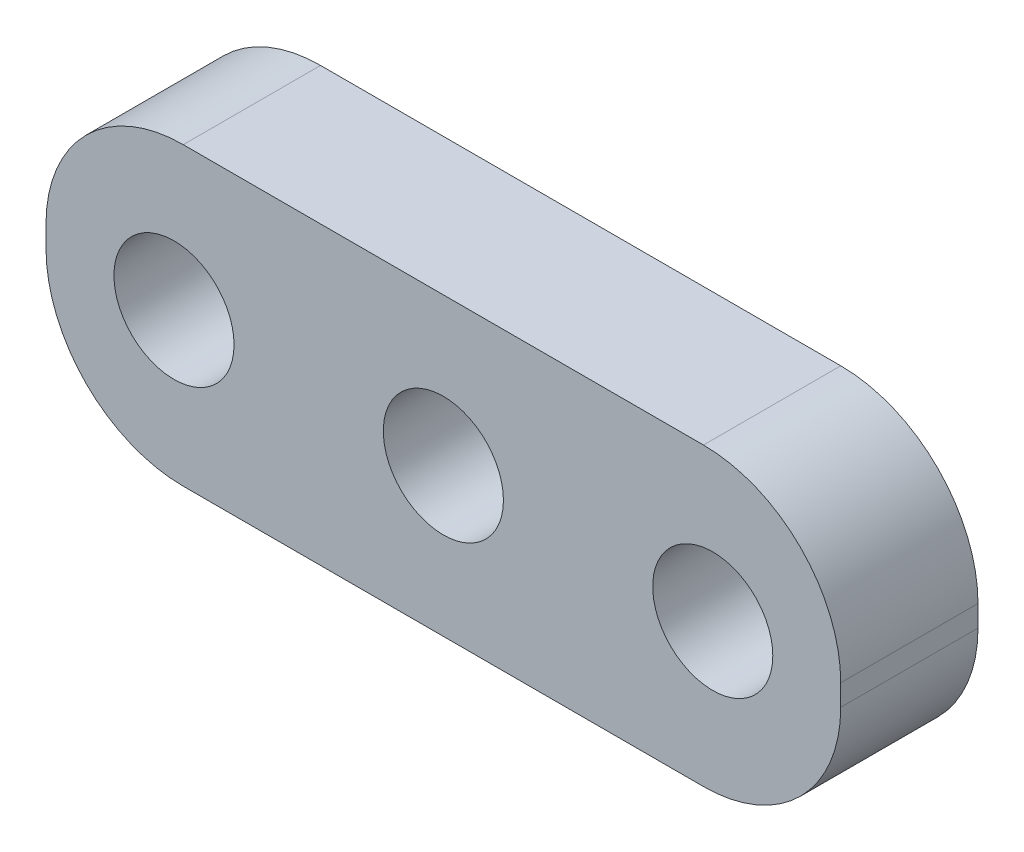
ISO-10303-21;
HEADER;
FILE_DESCRIPTION(('STEP AP214'),'2;1');
FILE_NAME('part.step','',(''),(''),'','','');
FILE_SCHEMA(('AUTOMOTIVE_DESIGN { 1 0 10303 214 1 1 1 1 }'));
ENDSEC;
DATA;
#1=APPLICATION_CONTEXT('core data for automotive mechanical design processes');
#2=APPLICATION_PROTOCOL_DEFINITION('international standard','automotive_design',2000,#1);
#3=PRODUCT_CONTEXT('',#1,'mechanical');
#4=PRODUCT('Part','Part','',(#3));
#5=PRODUCT_RELATED_PRODUCT_CATEGORY('part','',(#4));
#6=PRODUCT_DEFINITION_FORMATION('','',#4);
#7=PRODUCT_DEFINITION_CONTEXT('part definition',#1,'design');
#8=PRODUCT_DEFINITION('design','',#6,#7);
#9=PRODUCT_DEFINITION_SHAPE('','',#8);
#10=(LENGTH_UNIT() NAMED_UNIT(*) SI_UNIT(.MILLI.,.METRE.));
#11=(NAMED_UNIT(*) PLANE_ANGLE_UNIT() SI_UNIT($,.RADIAN.));
#12=(NAMED_UNIT(*) SI_UNIT($,.STERADIAN.) SOLID_ANGLE_UNIT());
#13=UNCERTAINTY_MEASURE_WITH_UNIT(LENGTH_MEASURE(1.E-05),#10,'distance_accuracy_value','');
#14=(GEOMETRIC_REPRESENTATION_CONTEXT(3) GLOBAL_UNCERTAINTY_ASSIGNED_CONTEXT((#13)) GLOBAL_UNIT_ASSIGNED_CONTEXT((#10,
#11,#12)) REPRESENTATION_CONTEXT('',''));
#15=CARTESIAN_POINT('',(0.,0.,0.));
#16=DIRECTION('',(0.,0.,1.));
#17=DIRECTION('',(1.,0.,0.));
#18=AXIS2_PLACEMENT_3D('',#15,#16,#17);
#19=CARTESIAN_POINT('',(0.,0.,4.));
#20=DIRECTION('',(0.,0.,1.));
#21=DIRECTION('',(1.,0.,0.));
#22=AXIS2_PLACEMENT_3D('',#19,#20,#21);
#23=PLANE('',#22);
#24=CARTESIAN_POINT('',(7.85,0.,4.));
#25=DIRECTION('',(0.,0.,1.));
#26=DIRECTION('',(1.,0.,0.));
#27=AXIS2_PLACEMENT_3D('',#24,#25,#26);
#28=CIRCLE('',#27,1.75);
#29=CARTESIAN_POINT('',(9.6,0.,4.));
#30=VERTEX_POINT('',#29);
#31=EDGE_CURVE('E181',#30,#30,#28,.T.);
#32=ORIENTED_EDGE('',*,*,#31,.F.);
#33=EDGE_LOOP('',(#32));
#34=FACE_BOUND('',#33,.T.);
#35=DIRECTION('',(1.,0.,0.));
#36=VECTOR('',#35,1.);
#37=CARTESIAN_POINT('',(11.58,-4.31,4.));
#38=LINE('',#37,#36);
#39=CARTESIAN_POINT('',(-7.58,-4.31,4.));
#40=VERTEX_POINT('',#39);
#41=CARTESIAN_POINT('',(7.58,-4.31,4.));
#42=VERTEX_POINT('',#41);
#43=EDGE_CURVE('E136',#40,#42,#38,.T.);
#44=ORIENTED_EDGE('',*,*,#43,.T.);
#45=CARTESIAN_POINT('',(7.58,-0.310000000000003,4.));
#46=DIRECTION('',(0.,0.,1.));
#47=DIRECTION('',(1.,0.,0.));
#48=AXIS2_PLACEMENT_3D('',#45,#46,#47);
#49=CIRCLE('',#48,4.);
#50=CARTESIAN_POINT('',(11.58,-0.310000000000003,4.));
#51=VERTEX_POINT('',#50);
#52=EDGE_CURVE('E155',#42,#51,#49,.T.);
#53=ORIENTED_EDGE('',*,*,#52,.T.);
#54=DIRECTION('',(0.,1.,0.));
#55=VECTOR('',#54,1.);
#56=CARTESIAN_POINT('',(11.58,-4.31,4.));
#57=LINE('',#56,#55);
#58=CARTESIAN_POINT('',(11.58,0.310000000000003,4.));
#59=VERTEX_POINT('',#58);
#60=EDGE_CURVE('E119',#51,#59,#57,.T.);
#61=ORIENTED_EDGE('',*,*,#60,.T.);
#62=CARTESIAN_POINT('',(7.58,0.310000000000003,4.));
#63=DIRECTION('',(0.,0.,1.));
#64=DIRECTION('',(1.,0.,0.));
#65=AXIS2_PLACEMENT_3D('',#62,#63,#64);
#66=CIRCLE('',#65,4.);
#67=CARTESIAN_POINT('',(7.58,4.31,4.));
#68=VERTEX_POINT('',#67);
#69=EDGE_CURVE('E153',#59,#68,#66,.T.);
#70=ORIENTED_EDGE('',*,*,#69,.T.);
#71=DIRECTION('',(-1.,0.,0.));
#72=VECTOR('',#71,1.);
#73=CARTESIAN_POINT('',(11.58,4.31,4.));
#74=LINE('',#73,#72);
#75=CARTESIAN_POINT('',(-7.58,4.31,4.));
#76=VERTEX_POINT('',#75);
#77=EDGE_CURVE('E166',#68,#76,#74,.T.);
#78=ORIENTED_EDGE('',*,*,#77,.T.);
#79=CARTESIAN_POINT('',(-7.58,0.310000000000003,4.));
#80=DIRECTION('',(0.,0.,1.));
#81=DIRECTION('',(1.,0.,0.));
#82=AXIS2_PLACEMENT_3D('',#79,#80,#81);
#83=CIRCLE('',#82,4.);
#84=CARTESIAN_POINT('',(-11.58,0.310000000000003,4.));
#85=VERTEX_POINT('',#84);
#86=EDGE_CURVE('E54',#76,#85,#83,.T.);
#87=ORIENTED_EDGE('',*,*,#86,.T.);
#88=DIRECTION('',(0.,-1.,0.));
#89=VECTOR('',#88,1.);
#90=CARTESIAN_POINT('',(-11.58,-4.31,4.));
#91=LINE('',#90,#89);
#92=CARTESIAN_POINT('',(-11.58,-0.310000000000003,4.));
#93=VERTEX_POINT('',#92);
#94=EDGE_CURVE('E174',#85,#93,#91,.T.);
#95=ORIENTED_EDGE('',*,*,#94,.T.);
#96=CARTESIAN_POINT('',(-7.58,-0.310000000000003,4.));
#97=DIRECTION('',(0.,0.,1.));
#98=DIRECTION('',(1.,0.,0.));
#99=AXIS2_PLACEMENT_3D('',#96,#97,#98);
#100=CIRCLE('',#99,4.);
#101=EDGE_CURVE('E150',#93,#40,#100,.T.);
#102=ORIENTED_EDGE('',*,*,#101,.T.);
#103=EDGE_LOOP('',(#44,#53,#61,#70,#78,#87,#95,#102));
#104=FACE_BOUND('',#103,.T.);
#105=CARTESIAN_POINT('',(-7.85,0.,4.));
#106=DIRECTION('',(0.,0.,1.));
#107=DIRECTION('',(1.,0.,0.));
#108=AXIS2_PLACEMENT_3D('',#105,#106,#107);
#109=CIRCLE('',#108,1.75);
#110=CARTESIAN_POINT('',(-6.1,0.,4.));
#111=VERTEX_POINT('',#110);
#112=EDGE_CURVE('E127',#111,#111,#109,.T.);
#113=ORIENTED_EDGE('',*,*,#112,.F.);
#114=EDGE_LOOP('',(#113));
#115=FACE_BOUND('',#114,.T.);
#116=CARTESIAN_POINT('',(0.,0.,4.));
#117=DIRECTION('',(0.,0.,1.));
#118=DIRECTION('',(1.,0.,0.));
#119=AXIS2_PLACEMENT_3D('',#116,#117,#118);
#120=CIRCLE('',#119,1.75);
#121=CARTESIAN_POINT('',(1.75,0.,4.));
#122=VERTEX_POINT('',#121);
#123=EDGE_CURVE('E186',#122,#122,#120,.T.);
#124=ORIENTED_EDGE('',*,*,#123,.F.);
#125=EDGE_LOOP('',(#124));
#126=FACE_BOUND('',#125,.T.);
#127=ADVANCED_FACE('F33',(#34,#104,#115,#126),#23,.T.);
#128=CARTESIAN_POINT('',(0.,0.,0.));
#129=DIRECTION('',(0.,0.,1.));
#130=DIRECTION('',(1.,0.,0.));
#131=AXIS2_PLACEMENT_3D('',#128,#129,#130);
#132=PLANE('',#131);
#133=DIRECTION('',(0.,1.,0.));
#134=VECTOR('',#133,1.);
#135=CARTESIAN_POINT('',(11.58,-4.31,0.));
#136=LINE('',#135,#134);
#137=CARTESIAN_POINT('',(11.58,-0.310000000000003,0.));
#138=VERTEX_POINT('',#137);
#139=CARTESIAN_POINT('',(11.58,0.310000000000003,0.));
#140=VERTEX_POINT('',#139);
#141=EDGE_CURVE('E116',#138,#140,#136,.T.);
#142=ORIENTED_EDGE('',*,*,#141,.F.);
#143=CARTESIAN_POINT('',(7.58,-0.310000000000003,0.));
#144=DIRECTION('',(0.,0.,1.));
#145=DIRECTION('',(1.,0.,0.));
#146=AXIS2_PLACEMENT_3D('',#143,#144,#145);
#147=CIRCLE('',#146,4.);
#148=CARTESIAN_POINT('',(7.58,-4.31,0.));
#149=VERTEX_POINT('',#148);
#150=EDGE_CURVE('E99',#138,#149,#147,.F.);
#151=ORIENTED_EDGE('',*,*,#150,.T.);
#152=DIRECTION('',(1.,0.,0.));
#153=VECTOR('',#152,1.);
#154=CARTESIAN_POINT('',(11.58,-4.31,0.));
#155=LINE('',#154,#153);
#156=CARTESIAN_POINT('',(-7.58,-4.31,0.));
#157=VERTEX_POINT('',#156);
#158=EDGE_CURVE('E140',#157,#149,#155,.T.);
#159=ORIENTED_EDGE('',*,*,#158,.F.);
#160=CARTESIAN_POINT('',(-7.58,-0.310000000000003,0.));
#161=DIRECTION('',(0.,0.,1.));
#162=DIRECTION('',(1.,0.,0.));
#163=AXIS2_PLACEMENT_3D('',#160,#161,#162);
#164=CIRCLE('',#163,4.);
#165=CARTESIAN_POINT('',(-11.58,-0.310000000000003,0.));
#166=VERTEX_POINT('',#165);
#167=EDGE_CURVE('E120',#157,#166,#164,.F.);
#168=ORIENTED_EDGE('',*,*,#167,.T.);
#169=DIRECTION('',(0.,-1.,0.));
#170=VECTOR('',#169,1.);
#171=CARTESIAN_POINT('',(-11.58,-4.31,0.));
#172=LINE('',#171,#170);
#173=CARTESIAN_POINT('',(-11.58,0.310000000000003,0.));
#174=VERTEX_POINT('',#173);
#175=EDGE_CURVE('E130',#174,#166,#172,.T.);
#176=ORIENTED_EDGE('',*,*,#175,.F.);
#177=CARTESIAN_POINT('',(-7.58,0.310000000000003,0.));
#178=DIRECTION('',(0.,0.,1.));
#179=DIRECTION('',(1.,0.,0.));
#180=AXIS2_PLACEMENT_3D('',#177,#178,#179);
#181=CIRCLE('',#180,4.);
#182=CARTESIAN_POINT('',(-7.58,4.31,0.));
#183=VERTEX_POINT('',#182);
#184=EDGE_CURVE('E144',#174,#183,#181,.F.);
#185=ORIENTED_EDGE('',*,*,#184,.T.);
#186=DIRECTION('',(-1.,0.,0.));
#187=VECTOR('',#186,1.);
#188=CARTESIAN_POINT('',(11.58,4.31,0.));
#189=LINE('',#188,#187);
#190=CARTESIAN_POINT('',(7.58,4.31,0.));
#191=VERTEX_POINT('',#190);
#192=EDGE_CURVE('E126',#191,#183,#189,.T.);
#193=ORIENTED_EDGE('',*,*,#192,.F.);
#194=CARTESIAN_POINT('',(7.58,0.310000000000003,0.));
#195=DIRECTION('',(0.,0.,1.));
#196=DIRECTION('',(1.,0.,0.));
#197=AXIS2_PLACEMENT_3D('',#194,#195,#196);
#198=CIRCLE('',#197,4.);
#199=EDGE_CURVE('E110',#191,#140,#198,.F.);
#200=ORIENTED_EDGE('',*,*,#199,.T.);
#201=EDGE_LOOP('',(#142,#151,#159,#168,#176,#185,#193,#200));
#202=FACE_BOUND('',#201,.T.);
#203=CARTESIAN_POINT('',(-7.85,0.,0.));
#204=DIRECTION('',(0.,0.,1.));
#205=DIRECTION('',(1.,0.,0.));
#206=AXIS2_PLACEMENT_3D('',#203,#204,#205);
#207=CIRCLE('',#206,1.75);
#208=CARTESIAN_POINT('',(-6.1,0.,0.));
#209=VERTEX_POINT('',#208);
#210=EDGE_CURVE('E133',#209,#209,#207,.T.);
#211=ORIENTED_EDGE('',*,*,#210,.T.);
#212=EDGE_LOOP('',(#211));
#213=FACE_BOUND('',#212,.T.);
#214=CARTESIAN_POINT('',(7.85,0.,0.));
#215=DIRECTION('',(0.,0.,1.));
#216=DIRECTION('',(1.,0.,0.));
#217=AXIS2_PLACEMENT_3D('',#214,#215,#216);
#218=CIRCLE('',#217,1.75);
#219=CARTESIAN_POINT('',(9.6,0.,0.));
#220=VERTEX_POINT('',#219);
#221=EDGE_CURVE('E183',#220,#220,#218,.T.);
#222=ORIENTED_EDGE('',*,*,#221,.T.);
#223=EDGE_LOOP('',(#222));
#224=FACE_BOUND('',#223,.T.);
#225=CARTESIAN_POINT('',(0.,0.,0.));
#226=DIRECTION('',(0.,0.,1.));
#227=DIRECTION('',(1.,0.,0.));
#228=AXIS2_PLACEMENT_3D('',#225,#226,#227);
#229=CIRCLE('',#228,1.75);
#230=CARTESIAN_POINT('',(1.75,0.,0.));
#231=VERTEX_POINT('',#230);
#232=EDGE_CURVE('E189',#231,#231,#229,.T.);
#233=ORIENTED_EDGE('',*,*,#232,.T.);
#234=EDGE_LOOP('',(#233));
#235=FACE_BOUND('',#234,.T.);
#236=ADVANCED_FACE('F123',(#202,#213,#224,#235),#132,.F.);
#237=CARTESIAN_POINT('',(11.58,-4.31,4.));
#238=DIRECTION('',(-1.,0.,0.));
#239=DIRECTION('',(0.,0.,1.));
#240=AXIS2_PLACEMENT_3D('',#237,#238,#239);
#241=PLANE('',#240);
#242=ORIENTED_EDGE('',*,*,#60,.F.);
#243=DIRECTION('',(0.,0.,-1.));
#244=VECTOR('',#243,1.);
#245=CARTESIAN_POINT('',(11.58,-0.310000000000003,4.));
#246=LINE('',#245,#244);
#247=EDGE_CURVE('E103',#51,#138,#246,.T.);
#248=ORIENTED_EDGE('',*,*,#247,.T.);
#249=ORIENTED_EDGE('',*,*,#141,.T.);
#250=DIRECTION('',(0.,0.,-1.));
#251=VECTOR('',#250,1.);
#252=CARTESIAN_POINT('',(11.58,0.310000000000003,4.));
#253=LINE('',#252,#251);
#254=EDGE_CURVE('E121',#140,#59,#253,.F.);
#255=ORIENTED_EDGE('',*,*,#254,.T.);
#256=EDGE_LOOP('',(#242,#248,#249,#255));
#257=FACE_BOUND('',#256,.T.);
#258=ADVANCED_FACE('F115',(#257),#241,.F.);
#259=CARTESIAN_POINT('',(11.58,4.31,4.));
#260=DIRECTION('',(0.,-1.,0.));
#261=DIRECTION('',(0.,0.,-1.));
#262=AXIS2_PLACEMENT_3D('',#259,#260,#261);
#263=PLANE('',#262);
#264=ORIENTED_EDGE('',*,*,#77,.F.);
#265=DIRECTION('',(0.,0.,-1.));
#266=VECTOR('',#265,1.);
#267=CARTESIAN_POINT('',(7.58,4.31,4.));
#268=LINE('',#267,#266);
#269=EDGE_CURVE('E159',#68,#191,#268,.T.);
#270=ORIENTED_EDGE('',*,*,#269,.T.);
#271=ORIENTED_EDGE('',*,*,#192,.T.);
#272=DIRECTION('',(0.,0.,-1.));
#273=VECTOR('',#272,1.);
#274=CARTESIAN_POINT('',(-7.58,4.31,4.));
#275=LINE('',#274,#273);
#276=EDGE_CURVE('E157',#183,#76,#275,.F.);
#277=ORIENTED_EDGE('',*,*,#276,.T.);
#278=EDGE_LOOP('',(#264,#270,#271,#277));
#279=FACE_BOUND('',#278,.T.);
#280=ADVANCED_FACE('F164',(#279),#263,.F.);
#281=CARTESIAN_POINT('',(-11.58,-4.31,4.));
#282=DIRECTION('',(1.,0.,0.));
#283=DIRECTION('',(0.,0.,-1.));
#284=AXIS2_PLACEMENT_3D('',#281,#282,#283);
#285=PLANE('',#284);
#286=ORIENTED_EDGE('',*,*,#94,.F.);
#287=DIRECTION('',(0.,0.,-1.));
#288=VECTOR('',#287,1.);
#289=CARTESIAN_POINT('',(-11.58,0.310000000000003,4.));
#290=LINE('',#289,#288);
#291=EDGE_CURVE('E11',#85,#174,#290,.T.);
#292=ORIENTED_EDGE('',*,*,#291,.T.);
#293=ORIENTED_EDGE('',*,*,#175,.T.);
#294=DIRECTION('',(0.,0.,-1.));
#295=VECTOR('',#294,1.);
#296=CARTESIAN_POINT('',(-11.58,-0.310000000000003,4.));
#297=LINE('',#296,#295);
#298=EDGE_CURVE('E41',#166,#93,#297,.F.);
#299=ORIENTED_EDGE('',*,*,#298,.T.);
#300=EDGE_LOOP('',(#286,#292,#293,#299));
#301=FACE_BOUND('',#300,.T.);
#302=ADVANCED_FACE('F173',(#301),#285,.F.);
#303=CARTESIAN_POINT('',(11.58,-4.31,4.));
#304=DIRECTION('',(0.,1.,0.));
#305=DIRECTION('',(0.,0.,1.));
#306=AXIS2_PLACEMENT_3D('',#303,#304,#305);
#307=PLANE('',#306);
#308=ORIENTED_EDGE('',*,*,#158,.T.);
#309=DIRECTION('',(0.,0.,-1.));
#310=VECTOR('',#309,1.);
#311=CARTESIAN_POINT('',(7.58,-4.31,4.));
#312=LINE('',#311,#310);
#313=EDGE_CURVE('E104',#149,#42,#312,.F.);
#314=ORIENTED_EDGE('',*,*,#313,.T.);
#315=ORIENTED_EDGE('',*,*,#43,.F.);
#316=DIRECTION('',(0.,0.,-1.));
#317=VECTOR('',#316,1.);
#318=CARTESIAN_POINT('',(-7.58,-4.31,4.));
#319=LINE('',#318,#317);
#320=EDGE_CURVE('E109',#40,#157,#319,.T.);
#321=ORIENTED_EDGE('',*,*,#320,.T.);
#322=EDGE_LOOP('',(#308,#314,#315,#321));
#323=FACE_BOUND('',#322,.T.);
#324=ADVANCED_FACE('F210',(#323),#307,.F.);
#325=CARTESIAN_POINT('',(-7.85,0.,4.));
#326=DIRECTION('',(0.,0.,-1.));
#327=DIRECTION('',(-1.,0.,0.));
#328=AXIS2_PLACEMENT_3D('',#325,#326,#327);
#329=CYLINDRICAL_SURFACE('',#328,1.75);
#330=ORIENTED_EDGE('',*,*,#112,.T.);
#331=EDGE_LOOP('',(#330));
#332=FACE_BOUND('',#331,.T.);
#333=ORIENTED_EDGE('',*,*,#210,.F.);
#334=EDGE_LOOP('',(#333));
#335=FACE_BOUND('',#334,.T.);
#336=ADVANCED_FACE('F207',(#332,#335),#329,.F.);
#337=CARTESIAN_POINT('',(7.85,0.,4.));
#338=DIRECTION('',(0.,0.,-1.));
#339=DIRECTION('',(-1.,0.,0.));
#340=AXIS2_PLACEMENT_3D('',#337,#338,#339);
#341=CYLINDRICAL_SURFACE('',#340,1.75);
#342=ORIENTED_EDGE('',*,*,#31,.T.);
#343=EDGE_LOOP('',(#342));
#344=FACE_BOUND('',#343,.T.);
#345=ORIENTED_EDGE('',*,*,#221,.F.);
#346=EDGE_LOOP('',(#345));
#347=FACE_BOUND('',#346,.T.);
#348=ADVANCED_FACE('F238',(#344,#347),#341,.F.);
#349=CARTESIAN_POINT('',(0.,0.,4.));
#350=DIRECTION('',(0.,0.,-1.));
#351=DIRECTION('',(-1.,0.,0.));
#352=AXIS2_PLACEMENT_3D('',#349,#350,#351);
#353=CYLINDRICAL_SURFACE('',#352,1.75);
#354=ORIENTED_EDGE('',*,*,#123,.T.);
#355=EDGE_LOOP('',(#354));
#356=FACE_BOUND('',#355,.T.);
#357=ORIENTED_EDGE('',*,*,#232,.F.);
#358=EDGE_LOOP('',(#357));
#359=FACE_BOUND('',#358,.T.);
#360=ADVANCED_FACE('F195',(#356,#359),#353,.F.);
#361=CARTESIAN_POINT('',(7.58,-0.310000000000003,4.));
#362=DIRECTION('',(0.,0.,-1.));
#363=DIRECTION('',(-1.,0.,0.));
#364=AXIS2_PLACEMENT_3D('',#361,#362,#363);
#365=CYLINDRICAL_SURFACE('',#364,4.);
#366=ORIENTED_EDGE('',*,*,#52,.F.);
#367=ORIENTED_EDGE('',*,*,#313,.F.);
#368=ORIENTED_EDGE('',*,*,#150,.F.);
#369=ORIENTED_EDGE('',*,*,#247,.F.);
#370=EDGE_LOOP('',(#366,#367,#368,#369));
#371=FACE_BOUND('',#370,.T.);
#372=ADVANCED_FACE('F102',(#371),#365,.T.);
#373=CARTESIAN_POINT('',(7.58,0.310000000000003,4.));
#374=DIRECTION('',(0.,0.,-1.));
#375=DIRECTION('',(-1.,0.,0.));
#376=AXIS2_PLACEMENT_3D('',#373,#374,#375);
#377=CYLINDRICAL_SURFACE('',#376,4.);
#378=ORIENTED_EDGE('',*,*,#69,.F.);
#379=ORIENTED_EDGE('',*,*,#254,.F.);
#380=ORIENTED_EDGE('',*,*,#199,.F.);
#381=ORIENTED_EDGE('',*,*,#269,.F.);
#382=EDGE_LOOP('',(#378,#379,#380,#381));
#383=FACE_BOUND('',#382,.T.);
#384=ADVANCED_FACE('F222',(#383),#377,.T.);
#385=CARTESIAN_POINT('',(-7.58,0.310000000000003,4.));
#386=DIRECTION('',(0.,0.,-1.));
#387=DIRECTION('',(-1.,0.,0.));
#388=AXIS2_PLACEMENT_3D('',#385,#386,#387);
#389=CYLINDRICAL_SURFACE('',#388,4.);
#390=ORIENTED_EDGE('',*,*,#86,.F.);
#391=ORIENTED_EDGE('',*,*,#276,.F.);
#392=ORIENTED_EDGE('',*,*,#184,.F.);
#393=ORIENTED_EDGE('',*,*,#291,.F.);
#394=EDGE_LOOP('',(#390,#391,#392,#393));
#395=FACE_BOUND('',#394,.T.);
#396=ADVANCED_FACE('F172',(#395),#389,.T.);
#397=CARTESIAN_POINT('',(-7.58,-0.310000000000003,4.));
#398=DIRECTION('',(0.,0.,-1.));
#399=DIRECTION('',(-1.,0.,0.));
#400=AXIS2_PLACEMENT_3D('',#397,#398,#399);
#401=CYLINDRICAL_SURFACE('',#400,4.);
#402=ORIENTED_EDGE('',*,*,#101,.F.);
#403=ORIENTED_EDGE('',*,*,#298,.F.);
#404=ORIENTED_EDGE('',*,*,#167,.F.);
#405=ORIENTED_EDGE('',*,*,#320,.F.);
#406=EDGE_LOOP('',(#402,#403,#404,#405));
#407=FACE_BOUND('',#406,.T.);
#408=ADVANCED_FACE('F35',(#407),#401,.T.);
#409=CLOSED_SHELL('',(#127,#236,#258,#280,#302,#324,#336,#348,#360,#372,#384,#396,#408));
#410=MANIFOLD_SOLID_BREP('B2',#409);
#411=ADVANCED_BREP_SHAPE_REPRESENTATION('',(#18,#410),#14);
#412=SHAPE_DEFINITION_REPRESENTATION(#9,#411);
ENDSEC;
END-ISO-10303-21;
